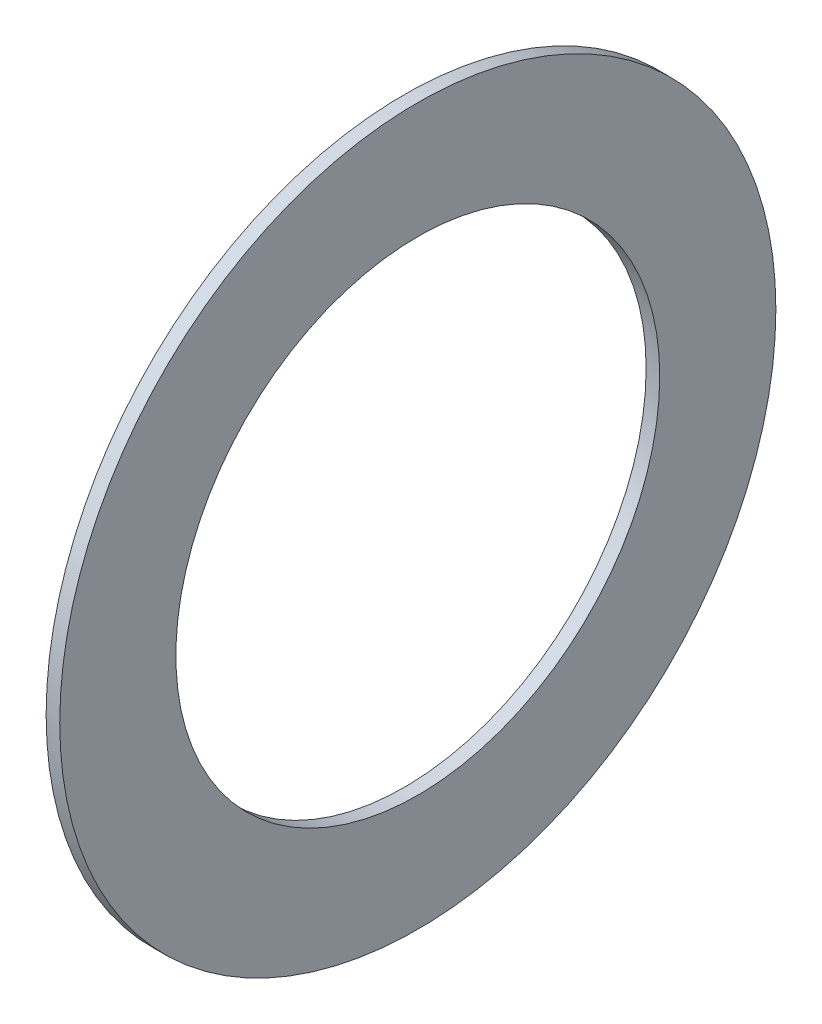
ISO-10303-21;
HEADER;
FILE_DESCRIPTION(('STEP AP214'),'2;1');
FILE_NAME('part.step','',(''),(''),'','','');
FILE_SCHEMA(('AUTOMOTIVE_DESIGN { 1 0 10303 214 1 1 1 1 }'));
ENDSEC;
DATA;
#1=APPLICATION_CONTEXT('core data for automotive mechanical design processes');
#2=APPLICATION_PROTOCOL_DEFINITION('international standard','automotive_design',2000,#1);
#3=PRODUCT_CONTEXT('',#1,'mechanical');
#4=PRODUCT('Part','Part','',(#3));
#5=PRODUCT_RELATED_PRODUCT_CATEGORY('part','',(#4));
#6=PRODUCT_DEFINITION_FORMATION('','',#4);
#7=PRODUCT_DEFINITION_CONTEXT('part definition',#1,'design');
#8=PRODUCT_DEFINITION('design','',#6,#7);
#9=PRODUCT_DEFINITION_SHAPE('','',#8);
#10=(LENGTH_UNIT() NAMED_UNIT(*) SI_UNIT(.MILLI.,.METRE.));
#11=(NAMED_UNIT(*) PLANE_ANGLE_UNIT() SI_UNIT($,.RADIAN.));
#12=(NAMED_UNIT(*) SI_UNIT($,.STERADIAN.) SOLID_ANGLE_UNIT());
#13=UNCERTAINTY_MEASURE_WITH_UNIT(LENGTH_MEASURE(1.E-05),#10,'distance_accuracy_value','');
#14=(GEOMETRIC_REPRESENTATION_CONTEXT(3) GLOBAL_UNCERTAINTY_ASSIGNED_CONTEXT((#13)) GLOBAL_UNIT_ASSIGNED_CONTEXT((#10,
#11,#12)) REPRESENTATION_CONTEXT('',''));
#15=CARTESIAN_POINT('',(0.,0.,0.));
#16=DIRECTION('',(0.,0.,1.));
#17=DIRECTION('',(1.,0.,0.));
#18=AXIS2_PLACEMENT_3D('',#15,#16,#17);
#19=CARTESIAN_POINT('',(0.1875,3.7,0.));
#20=DIRECTION('',(-1.,0.,0.));
#21=DIRECTION('',(0.,0.,1.));
#22=AXIS2_PLACEMENT_3D('',#19,#20,#21);
#23=PLANE('',#22);
#24=CARTESIAN_POINT('',(0.1875,0.,0.));
#25=DIRECTION('',(1.,0.,0.));
#26=DIRECTION('',(0.,0.,-1.));
#27=AXIS2_PLACEMENT_3D('',#24,#25,#26);
#28=CIRCLE('',#27,2.5);
#29=CARTESIAN_POINT('',(0.1875,0.,-2.5));
#30=VERTEX_POINT('',#29);
#31=EDGE_CURVE('E5',#30,#30,#28,.T.);
#32=ORIENTED_EDGE('',*,*,#31,.T.);
#33=EDGE_LOOP('',(#32));
#34=FACE_BOUND('',#33,.T.);
#35=CARTESIAN_POINT('',(0.1875,0.,0.));
#36=DIRECTION('',(1.,0.,0.));
#37=DIRECTION('',(0.,0.,-1.));
#38=AXIS2_PLACEMENT_3D('',#35,#36,#37);
#39=CIRCLE('',#38,3.7);
#40=CARTESIAN_POINT('',(0.1875,0.,-3.7));
#41=VERTEX_POINT('',#40);
#42=EDGE_CURVE('E9',#41,#41,#39,.T.);
#43=ORIENTED_EDGE('',*,*,#42,.F.);
#44=EDGE_LOOP('',(#43));
#45=FACE_BOUND('',#44,.T.);
#46=ADVANCED_FACE('F13',(#34,#45),#23,.T.);
#47=CARTESIAN_POINT('',(0.32805,0.,0.));
#48=DIRECTION('',(1.,0.,0.));
#49=DIRECTION('',(0.,0.,-1.));
#50=AXIS2_PLACEMENT_3D('',#47,#48,#49);
#51=CYLINDRICAL_SURFACE('',#50,2.5);
#52=CARTESIAN_POINT('',(0.32805,0.,0.));
#53=DIRECTION('',(1.,0.,0.));
#54=DIRECTION('',(0.,0.,-1.));
#55=AXIS2_PLACEMENT_3D('',#52,#53,#54);
#56=CIRCLE('',#55,2.5);
#57=CARTESIAN_POINT('',(0.32805,0.,-2.5));
#58=VERTEX_POINT('',#57);
#59=EDGE_CURVE('E24',#58,#58,#56,.T.);
#60=ORIENTED_EDGE('',*,*,#59,.T.);
#61=EDGE_LOOP('',(#60));
#62=FACE_BOUND('',#61,.T.);
#63=ORIENTED_EDGE('',*,*,#31,.F.);
#64=EDGE_LOOP('',(#63));
#65=FACE_BOUND('',#64,.T.);
#66=ADVANCED_FACE('F30',(#62,#65),#51,.F.);
#67=CARTESIAN_POINT('',(0.32805,0.,0.));
#68=DIRECTION('',(1.,0.,0.));
#69=DIRECTION('',(0.,0.,-1.));
#70=AXIS2_PLACEMENT_3D('',#67,#68,#69);
#71=CYLINDRICAL_SURFACE('',#70,3.7);
#72=ORIENTED_EDGE('',*,*,#42,.T.);
#73=EDGE_LOOP('',(#72));
#74=FACE_BOUND('',#73,.T.);
#75=CARTESIAN_POINT('',(0.32805,0.,0.));
#76=DIRECTION('',(1.,0.,0.));
#77=DIRECTION('',(0.,0.,-1.));
#78=AXIS2_PLACEMENT_3D('',#75,#76,#77);
#79=CIRCLE('',#78,3.7);
#80=CARTESIAN_POINT('',(0.32805,0.,-3.7));
#81=VERTEX_POINT('',#80);
#82=EDGE_CURVE('E39',#81,#81,#79,.T.);
#83=ORIENTED_EDGE('',*,*,#82,.F.);
#84=EDGE_LOOP('',(#83));
#85=FACE_BOUND('',#84,.T.);
#86=ADVANCED_FACE('F43',(#74,#85),#71,.T.);
#87=CARTESIAN_POINT('',(0.32805,2.5,0.));
#88=DIRECTION('',(1.,0.,0.));
#89=DIRECTION('',(0.,0.,-1.));
#90=AXIS2_PLACEMENT_3D('',#87,#88,#89);
#91=PLANE('',#90);
#92=ORIENTED_EDGE('',*,*,#82,.T.);
#93=EDGE_LOOP('',(#92));
#94=FACE_BOUND('',#93,.T.);
#95=ORIENTED_EDGE('',*,*,#59,.F.);
#96=EDGE_LOOP('',(#95));
#97=FACE_BOUND('',#96,.T.);
#98=ADVANCED_FACE('F54',(#94,#97),#91,.T.);
#99=CLOSED_SHELL('',(#46,#66,#86,#98));
#100=MANIFOLD_SOLID_BREP('B1',#99);
#101=ADVANCED_BREP_SHAPE_REPRESENTATION('',(#18,#100),#14);
#102=SHAPE_DEFINITION_REPRESENTATION(#9,#101);
ENDSEC;
END-ISO-10303-21;
